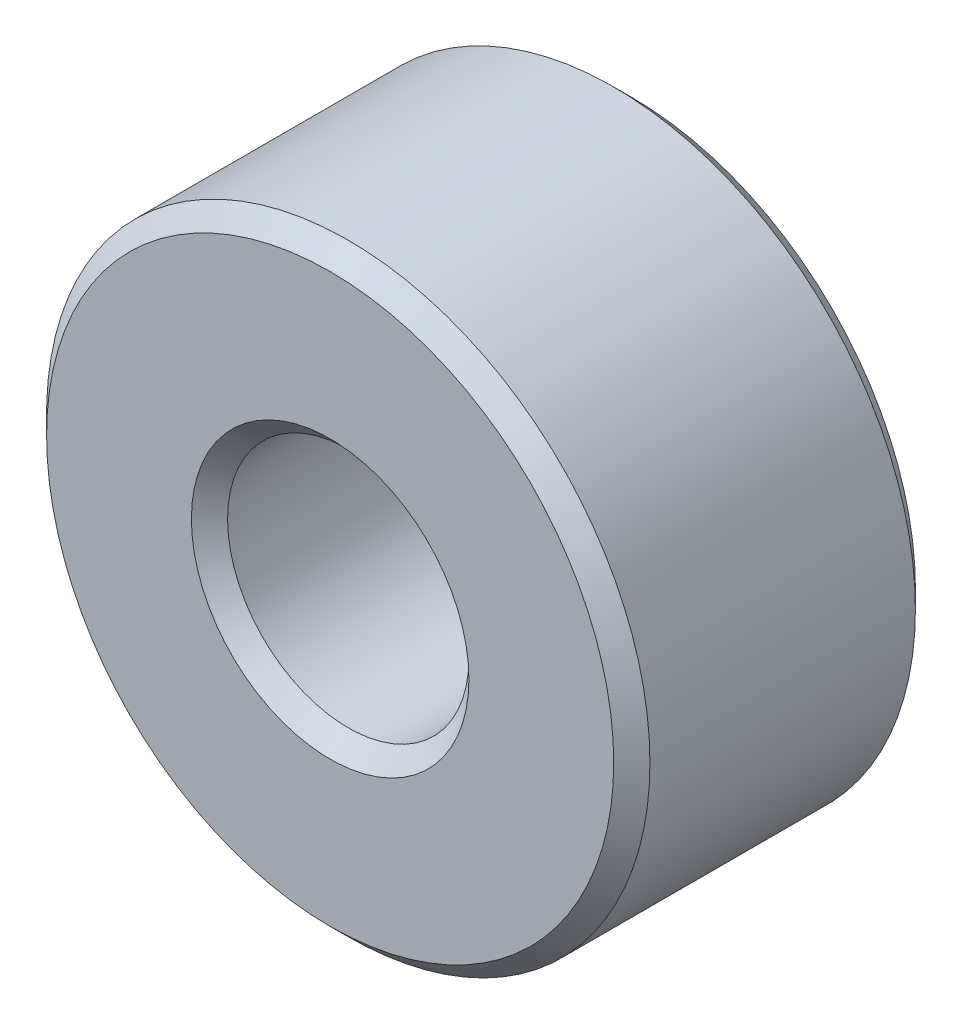
ISO-10303-21;
HEADER;
FILE_DESCRIPTION(('STEP AP214'),'2;1');
FILE_NAME('part.step','',(''),(''),'','','');
FILE_SCHEMA(('AUTOMOTIVE_DESIGN { 1 0 10303 214 1 1 1 1 }'));
ENDSEC;
DATA;
#1=APPLICATION_CONTEXT('core data for automotive mechanical design processes');
#2=APPLICATION_PROTOCOL_DEFINITION('international standard','automotive_design',2000,#1);
#3=PRODUCT_CONTEXT('',#1,'mechanical');
#4=PRODUCT('Part','Part','',(#3));
#5=PRODUCT_RELATED_PRODUCT_CATEGORY('part','',(#4));
#6=PRODUCT_DEFINITION_FORMATION('','',#4);
#7=PRODUCT_DEFINITION_CONTEXT('part definition',#1,'design');
#8=PRODUCT_DEFINITION('design','',#6,#7);
#9=PRODUCT_DEFINITION_SHAPE('','',#8);
#10=(LENGTH_UNIT() NAMED_UNIT(*) SI_UNIT(.MILLI.,.METRE.));
#11=(NAMED_UNIT(*) PLANE_ANGLE_UNIT() SI_UNIT($,.RADIAN.));
#12=(NAMED_UNIT(*) SI_UNIT($,.STERADIAN.) SOLID_ANGLE_UNIT());
#13=UNCERTAINTY_MEASURE_WITH_UNIT(LENGTH_MEASURE(1.E-05),#10,'distance_accuracy_value','');
#14=(GEOMETRIC_REPRESENTATION_CONTEXT(3) GLOBAL_UNCERTAINTY_ASSIGNED_CONTEXT((#13)) GLOBAL_UNIT_ASSIGNED_CONTEXT((#10,
#11,#12)) REPRESENTATION_CONTEXT('',''));
#15=CARTESIAN_POINT('',(0.,0.,0.));
#16=DIRECTION('',(0.,0.,1.));
#17=DIRECTION('',(1.,0.,0.));
#18=AXIS2_PLACEMENT_3D('',#15,#16,#17);
#19=CARTESIAN_POINT('',(0.,0.,-2.));
#20=DIRECTION('',(0.,0.,1.));
#21=DIRECTION('',(1.,0.,0.));
#22=AXIS2_PLACEMENT_3D('',#19,#20,#21);
#23=CYLINDRICAL_SURFACE('',#22,4.);
#24=CARTESIAN_POINT('',(0.,0.,1.76));
#25=DIRECTION('',(0.,0.,1.));
#26=DIRECTION('',(1.,0.,0.));
#27=AXIS2_PLACEMENT_3D('',#24,#25,#26);
#28=CIRCLE('',#27,4.);
#29=CARTESIAN_POINT('',(4.,0.,1.76));
#30=VERTEX_POINT('',#29);
#31=EDGE_CURVE('E57',#30,#30,#28,.F.);
#32=ORIENTED_EDGE('',*,*,#31,.T.);
#33=EDGE_LOOP('',(#32));
#34=FACE_BOUND('',#33,.T.);
#35=CARTESIAN_POINT('',(0.,0.,-1.76));
#36=DIRECTION('',(0.,0.,1.));
#37=DIRECTION('',(1.,0.,0.));
#38=AXIS2_PLACEMENT_3D('',#35,#36,#37);
#39=CIRCLE('',#38,4.);
#40=CARTESIAN_POINT('',(4.,0.,-1.76));
#41=VERTEX_POINT('',#40);
#42=EDGE_CURVE('E60',#41,#41,#39,.T.);
#43=ORIENTED_EDGE('',*,*,#42,.T.);
#44=EDGE_LOOP('',(#43));
#45=FACE_BOUND('',#44,.T.);
#46=ADVANCED_FACE('F37',(#34,#45),#23,.T.);
#47=CARTESIAN_POINT('',(0.,0.,-2.));
#48=DIRECTION('',(0.,0.,1.));
#49=DIRECTION('',(1.,0.,0.));
#50=AXIS2_PLACEMENT_3D('',#47,#48,#49);
#51=PLANE('',#50);
#52=CARTESIAN_POINT('',(0.,0.,-2.));
#53=DIRECTION('',(0.,0.,1.));
#54=DIRECTION('',(1.,0.,0.));
#55=AXIS2_PLACEMENT_3D('',#52,#53,#54);
#56=CIRCLE('',#55,3.76);
#57=CARTESIAN_POINT('',(3.76,0.,-2.));
#58=VERTEX_POINT('',#57);
#59=EDGE_CURVE('E48',#58,#58,#56,.F.);
#60=ORIENTED_EDGE('',*,*,#59,.T.);
#61=EDGE_LOOP('',(#60));
#62=FACE_BOUND('',#61,.T.);
#63=CARTESIAN_POINT('',(0.,0.,-2.));
#64=DIRECTION('',(0.,0.,1.));
#65=DIRECTION('',(1.,0.,0.));
#66=AXIS2_PLACEMENT_3D('',#63,#64,#65);
#67=CIRCLE('',#66,1.84);
#68=CARTESIAN_POINT('',(-1.84,0.,-2.));
#69=VERTEX_POINT('',#68);
#70=EDGE_CURVE('E52',#69,#69,#67,.T.);
#71=ORIENTED_EDGE('',*,*,#70,.T.);
#72=EDGE_LOOP('',(#71));
#73=FACE_BOUND('',#72,.T.);
#74=ADVANCED_FACE('F85',(#62,#73),#51,.F.);
#75=CARTESIAN_POINT('',(0.,0.,-2.));
#76=DIRECTION('',(0.,0.,1.));
#77=DIRECTION('',(1.,0.,0.));
#78=AXIS2_PLACEMENT_3D('',#75,#76,#77);
#79=CYLINDRICAL_SURFACE('',#78,1.6);
#80=CARTESIAN_POINT('',(0.,0.,1.76));
#81=DIRECTION('',(0.,0.,1.));
#82=DIRECTION('',(1.,0.,0.));
#83=AXIS2_PLACEMENT_3D('',#80,#81,#82);
#84=CIRCLE('',#83,1.6);
#85=CARTESIAN_POINT('',(1.6,0.,1.76));
#86=VERTEX_POINT('',#85);
#87=EDGE_CURVE('E10',#86,#86,#84,.T.);
#88=ORIENTED_EDGE('',*,*,#87,.T.);
#89=EDGE_LOOP('',(#88));
#90=FACE_BOUND('',#89,.T.);
#91=CARTESIAN_POINT('',(0.,0.,-1.76));
#92=DIRECTION('',(0.,0.,1.));
#93=DIRECTION('',(1.,0.,0.));
#94=AXIS2_PLACEMENT_3D('',#91,#92,#93);
#95=CIRCLE('',#94,1.6);
#96=CARTESIAN_POINT('',(-1.6,0.,-1.76));
#97=VERTEX_POINT('',#96);
#98=EDGE_CURVE('E44',#97,#97,#95,.F.);
#99=ORIENTED_EDGE('',*,*,#98,.T.);
#100=EDGE_LOOP('',(#99));
#101=FACE_BOUND('',#100,.T.);
#102=ADVANCED_FACE('F91',(#90,#101),#79,.F.);
#103=CARTESIAN_POINT('',(0.,0.,2.));
#104=DIRECTION('',(0.,0.,1.));
#105=DIRECTION('',(1.,0.,0.));
#106=AXIS2_PLACEMENT_3D('',#103,#104,#105);
#107=PLANE('',#106);
#108=CARTESIAN_POINT('',(0.,0.,2.));
#109=DIRECTION('',(0.,0.,1.));
#110=DIRECTION('',(1.,0.,0.));
#111=AXIS2_PLACEMENT_3D('',#108,#109,#110);
#112=CIRCLE('',#111,3.76);
#113=CARTESIAN_POINT('',(3.76,0.,2.));
#114=VERTEX_POINT('',#113);
#115=EDGE_CURVE('E63',#114,#114,#112,.T.);
#116=ORIENTED_EDGE('',*,*,#115,.T.);
#117=EDGE_LOOP('',(#116));
#118=FACE_BOUND('',#117,.T.);
#119=CARTESIAN_POINT('',(0.,0.,2.));
#120=DIRECTION('',(0.,0.,1.));
#121=DIRECTION('',(1.,0.,0.));
#122=AXIS2_PLACEMENT_3D('',#119,#120,#121);
#123=CIRCLE('',#122,1.84);
#124=CARTESIAN_POINT('',(1.84,0.,2.));
#125=VERTEX_POINT('',#124);
#126=EDGE_CURVE('E66',#125,#125,#123,.F.);
#127=ORIENTED_EDGE('',*,*,#126,.T.);
#128=EDGE_LOOP('',(#127));
#129=FACE_BOUND('',#128,.T.);
#130=ADVANCED_FACE('F70',(#118,#129),#107,.T.);
#131=CARTESIAN_POINT('',(0.,0.,2.));
#132=DIRECTION('',(0.,0.,-1.));
#133=DIRECTION('',(-1.,0.,0.));
#134=AXIS2_PLACEMENT_3D('',#131,#132,#133);
#135=CONICAL_SURFACE('',#134,3.76,0.78539816339745);
#136=ORIENTED_EDGE('',*,*,#31,.F.);
#137=EDGE_LOOP('',(#136));
#138=FACE_BOUND('',#137,.T.);
#139=ORIENTED_EDGE('',*,*,#115,.F.);
#140=EDGE_LOOP('',(#139));
#141=FACE_BOUND('',#140,.T.);
#142=ADVANCED_FACE('F81',(#138,#141),#135,.T.);
#143=CARTESIAN_POINT('',(0.,0.,-1.76));
#144=DIRECTION('',(0.,0.,1.));
#145=DIRECTION('',(1.,0.,0.));
#146=AXIS2_PLACEMENT_3D('',#143,#144,#145);
#147=CONICAL_SURFACE('',#146,4.,0.785398163397448);
#148=CARTESIAN_POINT('',(3.76,0.,-2.));
#149=CARTESIAN_POINT('',(3.7625,0.,-1.9975));
#150=CARTESIAN_POINT('',(3.765,0.,-1.995));
#151=CARTESIAN_POINT('',(3.77,0.,-1.99));
#152=CARTESIAN_POINT('',(3.7725,0.,-1.9875));
#153=CARTESIAN_POINT('',(3.7775,0.,-1.9825));
#154=CARTESIAN_POINT('',(3.78,0.,-1.98));
#155=CARTESIAN_POINT('',(3.785,0.,-1.975));
#156=CARTESIAN_POINT('',(3.7875,0.,-1.9725));
#157=CARTESIAN_POINT('',(3.7925,0.,-1.9675));
#158=CARTESIAN_POINT('',(3.795,0.,-1.965));
#159=CARTESIAN_POINT('',(3.8,0.,-1.96));
#160=CARTESIAN_POINT('',(3.8025,0.,-1.9575));
#161=CARTESIAN_POINT('',(3.8075,0.,-1.9525));
#162=CARTESIAN_POINT('',(3.81,0.,-1.95));
#163=CARTESIAN_POINT('',(3.815,0.,-1.945));
#164=CARTESIAN_POINT('',(3.8175,0.,-1.9425));
#165=CARTESIAN_POINT('',(3.8225,0.,-1.9375));
#166=CARTESIAN_POINT('',(3.825,0.,-1.935));
#167=CARTESIAN_POINT('',(3.83,0.,-1.93));
#168=CARTESIAN_POINT('',(3.8325,0.,-1.9275));
#169=CARTESIAN_POINT('',(3.8375,0.,-1.9225));
#170=CARTESIAN_POINT('',(3.84,0.,-1.92));
#171=CARTESIAN_POINT('',(3.845,0.,-1.915));
#172=CARTESIAN_POINT('',(3.8475,0.,-1.9125));
#173=CARTESIAN_POINT('',(3.8525,0.,-1.9075));
#174=CARTESIAN_POINT('',(3.855,0.,-1.905));
#175=CARTESIAN_POINT('',(3.86,0.,-1.9));
#176=CARTESIAN_POINT('',(3.8625,0.,-1.8975));
#177=CARTESIAN_POINT('',(3.8675,0.,-1.8925));
#178=CARTESIAN_POINT('',(3.87,0.,-1.89));
#179=CARTESIAN_POINT('',(3.875,0.,-1.885));
#180=CARTESIAN_POINT('',(3.8775,0.,-1.8825));
#181=CARTESIAN_POINT('',(3.8825,0.,-1.8775));
#182=CARTESIAN_POINT('',(3.885,0.,-1.875));
#183=CARTESIAN_POINT('',(3.89,0.,-1.87));
#184=CARTESIAN_POINT('',(3.8925,0.,-1.8675));
#185=CARTESIAN_POINT('',(3.8975,0.,-1.8625));
#186=CARTESIAN_POINT('',(3.9,0.,-1.86));
#187=CARTESIAN_POINT('',(3.905,0.,-1.855));
#188=CARTESIAN_POINT('',(3.9075,0.,-1.8525));
#189=CARTESIAN_POINT('',(3.9125,0.,-1.8475));
#190=CARTESIAN_POINT('',(3.915,0.,-1.845));
#191=CARTESIAN_POINT('',(3.92,0.,-1.84));
#192=CARTESIAN_POINT('',(3.9225,0.,-1.8375));
#193=CARTESIAN_POINT('',(3.9275,0.,-1.8325));
#194=CARTESIAN_POINT('',(3.93,0.,-1.83));
#195=CARTESIAN_POINT('',(3.935,0.,-1.825));
#196=CARTESIAN_POINT('',(3.9375,0.,-1.8225));
#197=CARTESIAN_POINT('',(3.9425,0.,-1.8175));
#198=CARTESIAN_POINT('',(3.945,0.,-1.815));
#199=CARTESIAN_POINT('',(3.95,0.,-1.81));
#200=CARTESIAN_POINT('',(3.9525,0.,-1.8075));
#201=CARTESIAN_POINT('',(3.9575,0.,-1.8025));
#202=CARTESIAN_POINT('',(3.96,0.,-1.8));
#203=CARTESIAN_POINT('',(3.965,0.,-1.795));
#204=CARTESIAN_POINT('',(3.9675,0.,-1.7925));
#205=CARTESIAN_POINT('',(3.9725,0.,-1.7875));
#206=CARTESIAN_POINT('',(3.975,0.,-1.785));
#207=CARTESIAN_POINT('',(3.98,0.,-1.78));
#208=CARTESIAN_POINT('',(3.9825,0.,-1.7775));
#209=CARTESIAN_POINT('',(3.9875,0.,-1.7725));
#210=CARTESIAN_POINT('',(3.99,0.,-1.77));
#211=CARTESIAN_POINT('',(3.995,0.,-1.765));
#212=CARTESIAN_POINT('',(3.9975,0.,-1.7625));
#213=CARTESIAN_POINT('',(4.,0.,-1.76));
#214=B_SPLINE_CURVE_WITH_KNOTS('',3,(#148,#149,#150,#151,#152,#153,#154,#155,#156,#157,#158,
#159,#160,#161,#162,#163,#164,#165,#166,#167,#168,#169,#170,#171,#172,#173,#174,#175,#176,#177,
#178,#179,#180,#181,#182,#183,#184,#185,#186,#187,#188,#189,#190,#191,#192,#193,#194,#195,#196,
#197,#198,#199,#200,#201,#202,#203,#204,#205,#206,#207,#208,#209,#210,#211,#212,#213),
.UNSPECIFIED.,.F.,.F.,(4,2,2,2,2,2,2,2,2,2,2,2,2,2,2,2,2,2,2,2,2,2,2,2,2,2,2,2,2,2,2,2,4),(0.,
0.0106066017177984,0.0212132034355962,0.0318198051533946,0.0424264068711923,0.0530330085889907,
0.0636396103067885,0.0742462120245864,0.0848528137423847,0.0954594154601826,0.106066017177981,
0.116672618895779,0.127279220613577,0.137885822331375,0.148492424049173,0.159099025766971,
0.169705627484769,0.180312229202567,0.190918830920365,0.201525432638163,0.212132034355961,
0.222738636073759,0.233345237791558,0.243951839509356,0.254558441227153,0.265165042944951,
0.27577164466275,0.286378246380548,0.296984848098346,0.307591449816144,0.318198051533942,
0.32880465325174,0.339411254969538),.UNSPECIFIED.);
#215=EDGE_CURVE('BSEAM75',#58,#41,#214,.T.);
#216=ORIENTED_EDGE('',*,*,#59,.F.);
#217=ORIENTED_EDGE('',*,*,#42,.F.);
#218=ORIENTED_EDGE('',*,*,#215,.T.);
#219=ORIENTED_EDGE('',*,*,#215,.F.);
#220=EDGE_LOOP('',(#216,#218,#217,#219));
#221=FACE_BOUND('',#220,.T.);
#222=ADVANCED_FACE('F75',(#221),#147,.T.);
#223=CARTESIAN_POINT('',(0.,0.,1.76));
#224=DIRECTION('',(0.,0.,1.));
#225=DIRECTION('',(1.,0.,0.));
#226=AXIS2_PLACEMENT_3D('',#223,#224,#225);
#227=CONICAL_SURFACE('',#226,1.6,0.78539816339745);
#228=ORIENTED_EDGE('',*,*,#126,.F.);
#229=EDGE_LOOP('',(#228));
#230=FACE_BOUND('',#229,.T.);
#231=ORIENTED_EDGE('',*,*,#87,.F.);
#232=EDGE_LOOP('',(#231));
#233=FACE_BOUND('',#232,.T.);
#234=ADVANCED_FACE('F72',(#230,#233),#227,.F.);
#235=CARTESIAN_POINT('',(0.,0.,-2.));
#236=DIRECTION('',(0.,0.,-1.));
#237=DIRECTION('',(-1.,0.,0.));
#238=AXIS2_PLACEMENT_3D('',#235,#236,#237);
#239=CONICAL_SURFACE('',#238,1.84,0.785398163397446);
#240=CARTESIAN_POINT('',(-1.6,0.,-1.76));
#241=CARTESIAN_POINT('',(-1.6025,0.,-1.7625));
#242=CARTESIAN_POINT('',(-1.605,0.,-1.765));
#243=CARTESIAN_POINT('',(-1.61,0.,-1.77));
#244=CARTESIAN_POINT('',(-1.6125,0.,-1.7725));
#245=CARTESIAN_POINT('',(-1.6175,0.,-1.7775));
#246=CARTESIAN_POINT('',(-1.62,0.,-1.78));
#247=CARTESIAN_POINT('',(-1.625,0.,-1.785));
#248=CARTESIAN_POINT('',(-1.6275,0.,-1.7875));
#249=CARTESIAN_POINT('',(-1.6325,0.,-1.7925));
#250=CARTESIAN_POINT('',(-1.635,0.,-1.795));
#251=CARTESIAN_POINT('',(-1.64,0.,-1.8));
#252=CARTESIAN_POINT('',(-1.6425,0.,-1.8025));
#253=CARTESIAN_POINT('',(-1.6475,0.,-1.8075));
#254=CARTESIAN_POINT('',(-1.65,0.,-1.81));
#255=CARTESIAN_POINT('',(-1.655,0.,-1.815));
#256=CARTESIAN_POINT('',(-1.6575,0.,-1.8175));
#257=CARTESIAN_POINT('',(-1.6625,0.,-1.8225));
#258=CARTESIAN_POINT('',(-1.665,0.,-1.825));
#259=CARTESIAN_POINT('',(-1.67,0.,-1.83));
#260=CARTESIAN_POINT('',(-1.6725,0.,-1.8325));
#261=CARTESIAN_POINT('',(-1.6775,0.,-1.8375));
#262=CARTESIAN_POINT('',(-1.68,0.,-1.84));
#263=CARTESIAN_POINT('',(-1.685,0.,-1.845));
#264=CARTESIAN_POINT('',(-1.6875,0.,-1.8475));
#265=CARTESIAN_POINT('',(-1.6925,0.,-1.8525));
#266=CARTESIAN_POINT('',(-1.695,0.,-1.855));
#267=CARTESIAN_POINT('',(-1.7,0.,-1.86));
#268=CARTESIAN_POINT('',(-1.7025,0.,-1.8625));
#269=CARTESIAN_POINT('',(-1.7075,0.,-1.8675));
#270=CARTESIAN_POINT('',(-1.71,0.,-1.87));
#271=CARTESIAN_POINT('',(-1.715,0.,-1.875));
#272=CARTESIAN_POINT('',(-1.7175,0.,-1.8775));
#273=CARTESIAN_POINT('',(-1.7225,0.,-1.8825));
#274=CARTESIAN_POINT('',(-1.725,0.,-1.885));
#275=CARTESIAN_POINT('',(-1.73,0.,-1.89));
#276=CARTESIAN_POINT('',(-1.7325,0.,-1.8925));
#277=CARTESIAN_POINT('',(-1.7375,0.,-1.8975));
#278=CARTESIAN_POINT('',(-1.74,0.,-1.9));
#279=CARTESIAN_POINT('',(-1.745,0.,-1.905));
#280=CARTESIAN_POINT('',(-1.7475,0.,-1.9075));
#281=CARTESIAN_POINT('',(-1.7525,0.,-1.9125));
#282=CARTESIAN_POINT('',(-1.755,0.,-1.915));
#283=CARTESIAN_POINT('',(-1.76,0.,-1.92));
#284=CARTESIAN_POINT('',(-1.7625,0.,-1.9225));
#285=CARTESIAN_POINT('',(-1.7675,0.,-1.9275));
#286=CARTESIAN_POINT('',(-1.77,0.,-1.93));
#287=CARTESIAN_POINT('',(-1.775,0.,-1.935));
#288=CARTESIAN_POINT('',(-1.7775,0.,-1.9375));
#289=CARTESIAN_POINT('',(-1.7825,0.,-1.9425));
#290=CARTESIAN_POINT('',(-1.785,0.,-1.945));
#291=CARTESIAN_POINT('',(-1.79,0.,-1.95));
#292=CARTESIAN_POINT('',(-1.7925,0.,-1.9525));
#293=CARTESIAN_POINT('',(-1.7975,0.,-1.9575));
#294=CARTESIAN_POINT('',(-1.8,0.,-1.96));
#295=CARTESIAN_POINT('',(-1.805,0.,-1.965));
#296=CARTESIAN_POINT('',(-1.8075,0.,-1.9675));
#297=CARTESIAN_POINT('',(-1.8125,0.,-1.9725));
#298=CARTESIAN_POINT('',(-1.815,0.,-1.975));
#299=CARTESIAN_POINT('',(-1.82,0.,-1.98));
#300=CARTESIAN_POINT('',(-1.8225,0.,-1.9825));
#301=CARTESIAN_POINT('',(-1.8275,0.,-1.9875));
#302=CARTESIAN_POINT('',(-1.83,0.,-1.99));
#303=CARTESIAN_POINT('',(-1.835,0.,-1.995));
#304=CARTESIAN_POINT('',(-1.8375,0.,-1.9975));
#305=CARTESIAN_POINT('',(-1.84,0.,-2.));
#306=B_SPLINE_CURVE_WITH_KNOTS('',3,(#240,#241,#242,#243,#244,#245,#246,#247,#248,#249,#250,
#251,#252,#253,#254,#255,#256,#257,#258,#259,#260,#261,#262,#263,#264,#265,#266,#267,#268,#269,
#270,#271,#272,#273,#274,#275,#276,#277,#278,#279,#280,#281,#282,#283,#284,#285,#286,#287,#288,
#289,#290,#291,#292,#293,#294,#295,#296,#297,#298,#299,#300,#301,#302,#303,#304,#305),
.UNSPECIFIED.,.F.,.F.,(4,2,2,2,2,2,2,2,2,2,2,2,2,2,2,2,2,2,2,2,2,2,2,2,2,2,2,2,2,2,2,2,4),(0.,
0.0106066017177982,0.0212132034355965,0.0318198051533947,0.0424264068711928,0.0530330085889909,
0.0636396103067891,0.0742462120245874,0.0848528137423855,0.0954594154601837,0.106066017177982,
0.11667261889578,0.127279220613578,0.137885822331376,0.148492424049174,0.159099025766973,
0.169705627484771,0.180312229202569,0.190918830920367,0.201525432638165,0.212132034355964,
0.222738636073762,0.23334523779156,0.243951839509358,0.254558441227156,0.265165042944954,
0.275771644662753,0.286378246380551,0.296984848098349,0.307591449816147,0.318198051533945,
0.328804653251744,0.339411254969541),.UNSPECIFIED.);
#307=EDGE_CURVE('BSEAM39',#97,#69,#306,.T.);
#308=ORIENTED_EDGE('',*,*,#98,.F.);
#309=ORIENTED_EDGE('',*,*,#70,.F.);
#310=ORIENTED_EDGE('',*,*,#307,.T.);
#311=ORIENTED_EDGE('',*,*,#307,.F.);
#312=EDGE_LOOP('',(#308,#310,#309,#311));
#313=FACE_BOUND('',#312,.T.);
#314=ADVANCED_FACE('F39',(#313),#239,.F.);
#315=CLOSED_SHELL('',(#46,#74,#102,#130,#142,#222,#234,#314));
#316=MANIFOLD_SOLID_BREP('B2',#315);
#317=ADVANCED_BREP_SHAPE_REPRESENTATION('',(#18,#316),#14);
#318=SHAPE_DEFINITION_REPRESENTATION(#9,#317);
ENDSEC;
END-ISO-10303-21;
